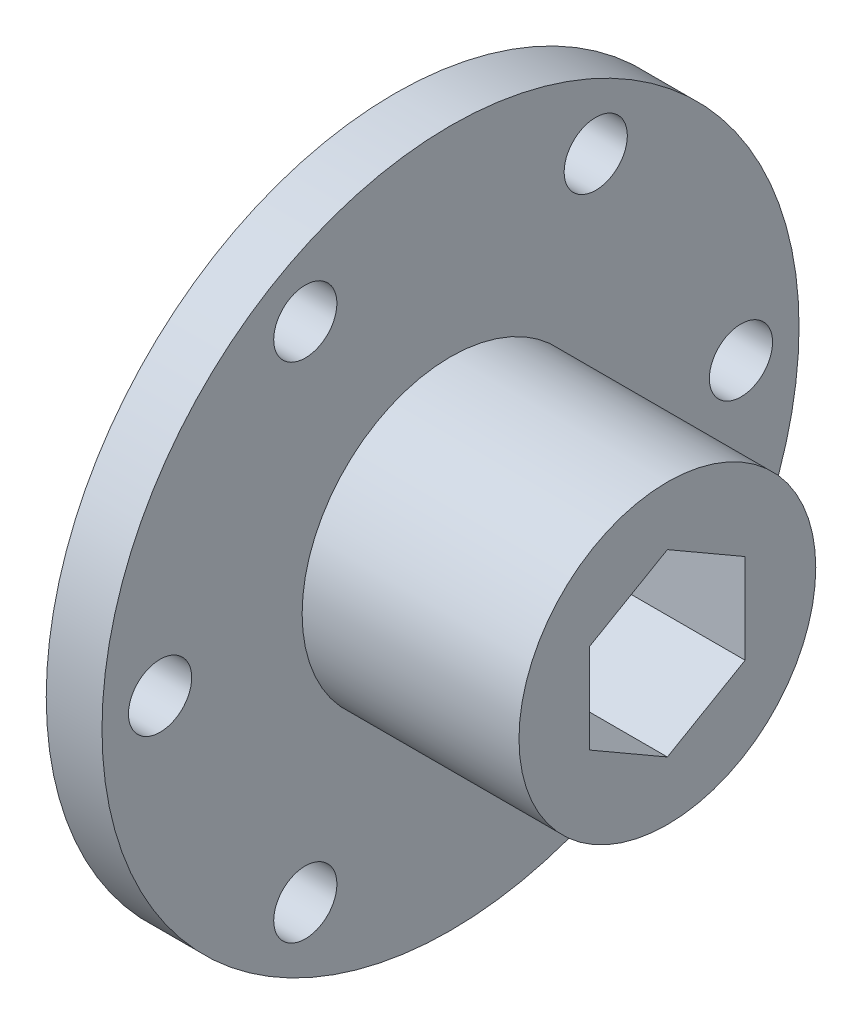
ISO-10303-21;
HEADER;
FILE_DESCRIPTION(('STEP AP214'),'2;1');
FILE_NAME('part.step','',(''),(''),'','','');
FILE_SCHEMA(('AUTOMOTIVE_DESIGN { 1 0 10303 214 1 1 1 1 }'));
ENDSEC;
DATA;
#1=APPLICATION_CONTEXT('core data for automotive mechanical design processes');
#2=APPLICATION_PROTOCOL_DEFINITION('international standard','automotive_design',2000,#1);
#3=PRODUCT_CONTEXT('',#1,'mechanical');
#4=PRODUCT('Part','Part','',(#3));
#5=PRODUCT_RELATED_PRODUCT_CATEGORY('part','',(#4));
#6=PRODUCT_DEFINITION_FORMATION('','',#4);
#7=PRODUCT_DEFINITION_CONTEXT('part definition',#1,'design');
#8=PRODUCT_DEFINITION('design','',#6,#7);
#9=PRODUCT_DEFINITION_SHAPE('','',#8);
#10=(LENGTH_UNIT() NAMED_UNIT(*) SI_UNIT(.MILLI.,.METRE.));
#11=(NAMED_UNIT(*) PLANE_ANGLE_UNIT() SI_UNIT($,.RADIAN.));
#12=(NAMED_UNIT(*) SI_UNIT($,.STERADIAN.) SOLID_ANGLE_UNIT());
#13=UNCERTAINTY_MEASURE_WITH_UNIT(LENGTH_MEASURE(1.E-05),#10,'distance_accuracy_value','');
#14=(GEOMETRIC_REPRESENTATION_CONTEXT(3) GLOBAL_UNCERTAINTY_ASSIGNED_CONTEXT((#13)) GLOBAL_UNIT_ASSIGNED_CONTEXT((#10,
#11,#12)) REPRESENTATION_CONTEXT('',''));
#15=CARTESIAN_POINT('',(0.,0.,0.));
#16=DIRECTION('',(0.,0.,1.));
#17=DIRECTION('',(1.,0.,0.));
#18=AXIS2_PLACEMENT_3D('',#15,#16,#17);
#19=CARTESIAN_POINT('',(-13.0350662460568,0.,0.));
#20=DIRECTION('',(1.,0.,0.));
#21=DIRECTION('',(0.,0.,-1.));
#22=AXIS2_PLACEMENT_3D('',#19,#20,#21);
#23=PLANE('',#22);
#24=CARTESIAN_POINT('',(-13.0350662460568,-20.6222299276169,11.90625));
#25=DIRECTION('',(1.,0.,0.));
#26=DIRECTION('',(0.,0.,-1.));
#27=AXIS2_PLACEMENT_3D('',#24,#25,#26);
#28=CIRCLE('',#27,2.59080000000001);
#29=CARTESIAN_POINT('',(-13.0350662460568,-20.6222299276169,9.31544999999996));
#30=VERTEX_POINT('',#29);
#31=EDGE_CURVE('E220',#30,#30,#28,.T.);
#32=ORIENTED_EDGE('',*,*,#31,.F.);
#33=EDGE_LOOP('',(#32));
#34=FACE_BOUND('',#33,.T.);
#35=CARTESIAN_POINT('',(-13.0350662460568,-20.6222299276169,-11.90625));
#36=DIRECTION('',(1.,0.,0.));
#37=DIRECTION('',(0.,0.,-1.));
#38=AXIS2_PLACEMENT_3D('',#35,#36,#37);
#39=CIRCLE('',#38,2.59080000000001);
#40=CARTESIAN_POINT('',(-13.0350662460568,-20.6222299276169,-14.49705));
#41=VERTEX_POINT('',#40);
#42=EDGE_CURVE('E230',#41,#41,#39,.T.);
#43=ORIENTED_EDGE('',*,*,#42,.F.);
#44=EDGE_LOOP('',(#43));
#45=FACE_BOUND('',#44,.T.);
#46=CARTESIAN_POINT('',(-13.0350662460568,0.,-23.8125));
#47=DIRECTION('',(1.,0.,0.));
#48=DIRECTION('',(0.,0.,-1.));
#49=AXIS2_PLACEMENT_3D('',#46,#47,#48);
#50=CIRCLE('',#49,2.59080000000001);
#51=CARTESIAN_POINT('',(-13.0350662460568,0.,-26.4033));
#52=VERTEX_POINT('',#51);
#53=EDGE_CURVE('E236',#52,#52,#50,.T.);
#54=ORIENTED_EDGE('',*,*,#53,.F.);
#55=EDGE_LOOP('',(#54));
#56=FACE_BOUND('',#55,.T.);
#57=CARTESIAN_POINT('',(-13.0350662460568,20.6222299276169,-11.90625));
#58=DIRECTION('',(1.,0.,0.));
#59=DIRECTION('',(0.,0.,-1.));
#60=AXIS2_PLACEMENT_3D('',#57,#58,#59);
#61=CIRCLE('',#60,2.59080000000001);
#62=CARTESIAN_POINT('',(-13.0350662460568,20.6222299276169,-14.49705));
#63=VERTEX_POINT('',#62);
#64=EDGE_CURVE('E242',#63,#63,#61,.T.);
#65=ORIENTED_EDGE('',*,*,#64,.F.);
#66=EDGE_LOOP('',(#65));
#67=FACE_BOUND('',#66,.T.);
#68=CARTESIAN_POINT('',(-13.0350662460568,20.6222299276169,11.90625));
#69=DIRECTION('',(1.,0.,0.));
#70=DIRECTION('',(0.,0.,-1.));
#71=AXIS2_PLACEMENT_3D('',#68,#69,#70);
#72=CIRCLE('',#71,2.59080000000001);
#73=CARTESIAN_POINT('',(-13.0350662460568,20.6222299276169,9.31544999999999));
#74=VERTEX_POINT('',#73);
#75=EDGE_CURVE('E248',#74,#74,#72,.T.);
#76=ORIENTED_EDGE('',*,*,#75,.F.);
#77=EDGE_LOOP('',(#76));
#78=FACE_BOUND('',#77,.T.);
#79=CARTESIAN_POINT('',(-13.0350662460568,0.,23.8125));
#80=DIRECTION('',(1.,0.,0.));
#81=DIRECTION('',(0.,0.,-1.));
#82=AXIS2_PLACEMENT_3D('',#79,#80,#81);
#83=CIRCLE('',#82,2.59080000000001);
#84=CARTESIAN_POINT('',(-13.0350662460568,0.,21.2217));
#85=VERTEX_POINT('',#84);
#86=EDGE_CURVE('E111',#85,#85,#83,.T.);
#87=ORIENTED_EDGE('',*,*,#86,.F.);
#88=EDGE_LOOP('',(#87));
#89=FACE_BOUND('',#88,.T.);
#90=CARTESIAN_POINT('',(-13.0350662460568,0.,0.));
#91=DIRECTION('',(1.,0.,0.));
#92=DIRECTION('',(0.,0.,-1.));
#93=AXIS2_PLACEMENT_3D('',#90,#91,#92);
#94=CIRCLE('',#93,28.575);
#95=CARTESIAN_POINT('',(-13.0350662460568,0.,-28.575));
#96=VERTEX_POINT('',#95);
#97=EDGE_CURVE('E41',#96,#96,#94,.T.);
#98=ORIENTED_EDGE('',*,*,#97,.T.);
#99=EDGE_LOOP('',(#98));
#100=FACE_BOUND('',#99,.T.);
#101=CARTESIAN_POINT('',(-13.0350662460568,0.,0.));
#102=DIRECTION('',(1.,0.,0.));
#103=DIRECTION('',(0.,0.,-1.));
#104=AXIS2_PLACEMENT_3D('',#101,#102,#103);
#105=CIRCLE('',#104,12.1666);
#106=CARTESIAN_POINT('',(-13.0350662460568,0.,-12.1666));
#107=VERTEX_POINT('',#106);
#108=EDGE_CURVE('E134',#107,#107,#105,.T.);
#109=ORIENTED_EDGE('',*,*,#108,.F.);
#110=EDGE_LOOP('',(#109));
#111=FACE_BOUND('',#110,.T.);
#112=ADVANCED_FACE('F33',(#34,#45,#56,#67,#78,#89,#100,#111),#23,.T.);
#113=CARTESIAN_POINT('',(-17.6070662460568,0.,0.));
#114=DIRECTION('',(1.,0.,0.));
#115=DIRECTION('',(0.,0.,-1.));
#116=AXIS2_PLACEMENT_3D('',#113,#114,#115);
#117=CYLINDRICAL_SURFACE('',#116,28.575);
#118=CARTESIAN_POINT('',(-17.6070662460568,0.,0.));
#119=DIRECTION('',(1.,0.,0.));
#120=DIRECTION('',(0.,0.,-1.));
#121=AXIS2_PLACEMENT_3D('',#118,#119,#120);
#122=CIRCLE('',#121,28.575);
#123=CARTESIAN_POINT('',(-17.6070662460568,0.,-28.575));
#124=VERTEX_POINT('',#123);
#125=EDGE_CURVE('E11',#124,#124,#122,.T.);
#126=ORIENTED_EDGE('',*,*,#125,.T.);
#127=EDGE_LOOP('',(#126));
#128=FACE_BOUND('',#127,.T.);
#129=ORIENTED_EDGE('',*,*,#97,.F.);
#130=EDGE_LOOP('',(#129));
#131=FACE_BOUND('',#130,.T.);
#132=ADVANCED_FACE('F35',(#128,#131),#117,.T.);
#133=CARTESIAN_POINT('',(-17.6070662460568,28.575,0.));
#134=DIRECTION('',(-1.,0.,0.));
#135=DIRECTION('',(0.,0.,1.));
#136=AXIS2_PLACEMENT_3D('',#133,#134,#135);
#137=PLANE('',#136);
#138=CARTESIAN_POINT('',(-17.6070662460568,-20.6222299276169,11.90625));
#139=DIRECTION('',(-1.,0.,0.));
#140=DIRECTION('',(0.,0.,1.));
#141=AXIS2_PLACEMENT_3D('',#138,#139,#140);
#142=CIRCLE('',#141,2.59080000000001);
#143=CARTESIAN_POINT('',(-17.6070662460568,-20.6222299276169,14.49705));
#144=VERTEX_POINT('',#143);
#145=EDGE_CURVE('E223',#144,#144,#142,.T.);
#146=ORIENTED_EDGE('',*,*,#145,.F.);
#147=EDGE_LOOP('',(#146));
#148=FACE_BOUND('',#147,.T.);
#149=CARTESIAN_POINT('',(-17.6070662460568,-20.6222299276169,-11.90625));
#150=DIRECTION('',(-1.,0.,0.));
#151=DIRECTION('',(0.,0.,1.));
#152=AXIS2_PLACEMENT_3D('',#149,#150,#151);
#153=CIRCLE('',#152,2.59080000000001);
#154=CARTESIAN_POINT('',(-17.6070662460568,-20.6222299276169,-9.31544999999999));
#155=VERTEX_POINT('',#154);
#156=EDGE_CURVE('E225',#155,#155,#153,.T.);
#157=ORIENTED_EDGE('',*,*,#156,.F.);
#158=EDGE_LOOP('',(#157));
#159=FACE_BOUND('',#158,.T.);
#160=CARTESIAN_POINT('',(-17.6070662460568,0.,-23.8125));
#161=DIRECTION('',(-1.,0.,0.));
#162=DIRECTION('',(0.,0.,1.));
#163=AXIS2_PLACEMENT_3D('',#160,#161,#162);
#164=CIRCLE('',#163,2.59080000000001);
#165=CARTESIAN_POINT('',(-17.6070662460568,0.,-21.2217));
#166=VERTEX_POINT('',#165);
#167=EDGE_CURVE('E233',#166,#166,#164,.T.);
#168=ORIENTED_EDGE('',*,*,#167,.F.);
#169=EDGE_LOOP('',(#168));
#170=FACE_BOUND('',#169,.T.);
#171=CARTESIAN_POINT('',(-17.6070662460568,20.6222299276169,-11.90625));
#172=DIRECTION('',(-1.,0.,0.));
#173=DIRECTION('',(0.,0.,1.));
#174=AXIS2_PLACEMENT_3D('',#171,#172,#173);
#175=CIRCLE('',#174,2.59080000000001);
#176=CARTESIAN_POINT('',(-17.6070662460568,20.6222299276169,-9.31544999999999));
#177=VERTEX_POINT('',#176);
#178=EDGE_CURVE('E239',#177,#177,#175,.T.);
#179=ORIENTED_EDGE('',*,*,#178,.F.);
#180=EDGE_LOOP('',(#179));
#181=FACE_BOUND('',#180,.T.);
#182=CARTESIAN_POINT('',(-17.6070662460568,20.6222299276169,11.90625));
#183=DIRECTION('',(-1.,0.,0.));
#184=DIRECTION('',(0.,0.,1.));
#185=AXIS2_PLACEMENT_3D('',#182,#183,#184);
#186=CIRCLE('',#185,2.59080000000001);
#187=CARTESIAN_POINT('',(-17.6070662460568,20.6222299276169,14.49705));
#188=VERTEX_POINT('',#187);
#189=EDGE_CURVE('E245',#188,#188,#186,.T.);
#190=ORIENTED_EDGE('',*,*,#189,.F.);
#191=EDGE_LOOP('',(#190));
#192=FACE_BOUND('',#191,.T.);
#193=CARTESIAN_POINT('',(-17.6070662460568,0.,23.8125));
#194=DIRECTION('',(-1.,0.,0.));
#195=DIRECTION('',(0.,0.,1.));
#196=AXIS2_PLACEMENT_3D('',#193,#194,#195);
#197=CIRCLE('',#196,2.59080000000001);
#198=CARTESIAN_POINT('',(-17.6070662460568,0.,26.4033));
#199=VERTEX_POINT('',#198);
#200=EDGE_CURVE('E250',#199,#199,#197,.T.);
#201=ORIENTED_EDGE('',*,*,#200,.F.);
#202=EDGE_LOOP('',(#201));
#203=FACE_BOUND('',#202,.T.);
#204=DIRECTION('',(0.,-0.5,0.866025403784438));
#205=VECTOR('',#204,1.);
#206=CARTESIAN_POINT('',(-17.6070662460568,-3.68085890619154,-6.3754));
#207=LINE('',#206,#205);
#208=CARTESIAN_POINT('',(-17.6070662460568,-3.68085890619154,-6.3754));
#209=VERTEX_POINT('',#208);
#210=CARTESIAN_POINT('',(-17.6070662460568,-7.36169781238309,0.));
#211=VERTEX_POINT('',#210);
#212=EDGE_CURVE('E48',#209,#211,#207,.T.);
#213=ORIENTED_EDGE('',*,*,#212,.F.);
#214=DIRECTION('',(0.,-1.,0.));
#215=VECTOR('',#214,1.);
#216=CARTESIAN_POINT('',(-17.6070662460568,3.68081890619155,-6.3754));
#217=LINE('',#216,#215);
#218=CARTESIAN_POINT('',(-17.6070662460568,3.68081890619155,-6.3754));
#219=VERTEX_POINT('',#218);
#220=EDGE_CURVE('E105',#219,#209,#217,.T.);
#221=ORIENTED_EDGE('',*,*,#220,.F.);
#222=DIRECTION('',(0.,-0.5,-0.866025403784439));
#223=VECTOR('',#222,1.);
#224=CARTESIAN_POINT('',(-17.6070662460568,7.36165781238309,0.));
#225=LINE('',#224,#223);
#226=CARTESIAN_POINT('',(-17.6070662460568,7.36165781238309,0.));
#227=VERTEX_POINT('',#226);
#228=EDGE_CURVE('E108',#227,#219,#225,.T.);
#229=ORIENTED_EDGE('',*,*,#228,.F.);
#230=DIRECTION('',(0.,0.5,-0.866025403784439));
#231=VECTOR('',#230,1.);
#232=CARTESIAN_POINT('',(-17.6070662460568,3.68081890619155,6.3754));
#233=LINE('',#232,#231);
#234=CARTESIAN_POINT('',(-17.6070662460568,3.68081890619155,6.3754));
#235=VERTEX_POINT('',#234);
#236=EDGE_CURVE('E127',#235,#227,#233,.T.);
#237=ORIENTED_EDGE('',*,*,#236,.F.);
#238=DIRECTION('',(0.,1.,0.));
#239=VECTOR('',#238,1.);
#240=CARTESIAN_POINT('',(-17.6070662460568,-3.68085890619154,6.3754));
#241=LINE('',#240,#239);
#242=CARTESIAN_POINT('',(-17.6070662460568,-3.68085890619154,6.3754));
#243=VERTEX_POINT('',#242);
#244=EDGE_CURVE('E124',#243,#235,#241,.T.);
#245=ORIENTED_EDGE('',*,*,#244,.F.);
#246=DIRECTION('',(0.,0.500000000000001,0.866025403784438));
#247=VECTOR('',#246,1.);
#248=CARTESIAN_POINT('',(-17.6070662460568,-7.36169781238309,0.));
#249=LINE('',#248,#247);
#250=EDGE_CURVE('E122',#211,#243,#249,.T.);
#251=ORIENTED_EDGE('',*,*,#250,.F.);
#252=EDGE_LOOP('',(#213,#221,#229,#237,#245,#251));
#253=FACE_BOUND('',#252,.T.);
#254=ORIENTED_EDGE('',*,*,#125,.F.);
#255=EDGE_LOOP('',(#254));
#256=FACE_BOUND('',#255,.T.);
#257=ADVANCED_FACE('F152',(#148,#159,#170,#181,#192,#203,#253,#256),#137,.T.);
#258=CARTESIAN_POINT('',(4.74493375394323,0.,0.));
#259=DIRECTION('',(-1.,0.,0.));
#260=DIRECTION('',(0.,0.,1.));
#261=AXIS2_PLACEMENT_3D('',#258,#259,#260);
#262=CYLINDRICAL_SURFACE('',#261,12.1666);
#263=CARTESIAN_POINT('',(4.74493375394323,0.,0.));
#264=DIRECTION('',(1.,0.,0.));
#265=DIRECTION('',(0.,0.,-1.));
#266=AXIS2_PLACEMENT_3D('',#263,#264,#265);
#267=CIRCLE('',#266,12.1666);
#268=CARTESIAN_POINT('',(4.74493375394323,0.,-12.1666));
#269=VERTEX_POINT('',#268);
#270=EDGE_CURVE('E142',#269,#269,#267,.T.);
#271=ORIENTED_EDGE('',*,*,#270,.F.);
#272=EDGE_LOOP('',(#271));
#273=FACE_BOUND('',#272,.T.);
#274=ORIENTED_EDGE('',*,*,#108,.T.);
#275=EDGE_LOOP('',(#274));
#276=FACE_BOUND('',#275,.T.);
#277=ADVANCED_FACE('F158',(#273,#276),#262,.T.);
#278=CARTESIAN_POINT('',(4.74493375394323,0.,0.));
#279=DIRECTION('',(1.,0.,0.));
#280=DIRECTION('',(0.,0.,-1.));
#281=AXIS2_PLACEMENT_3D('',#278,#279,#280);
#282=PLANE('',#281);
#283=DIRECTION('',(0.,-0.5,0.866025403784438));
#284=VECTOR('',#283,1.);
#285=CARTESIAN_POINT('',(4.74493375394323,-3.68085890619154,-6.3754));
#286=LINE('',#285,#284);
#287=CARTESIAN_POINT('',(4.74493375394323,-3.68085890619154,-6.3754));
#288=VERTEX_POINT('',#287);
#289=CARTESIAN_POINT('',(4.74493375394323,-7.36169781238309,0.));
#290=VERTEX_POINT('',#289);
#291=EDGE_CURVE('E88',#288,#290,#286,.T.);
#292=ORIENTED_EDGE('',*,*,#291,.T.);
#293=DIRECTION('',(0.,0.500000000000001,0.866025403784438));
#294=VECTOR('',#293,1.);
#295=CARTESIAN_POINT('',(4.74493375394323,-7.36169781238309,0.));
#296=LINE('',#295,#294);
#297=CARTESIAN_POINT('',(4.74493375394323,-3.68085890619154,6.3754));
#298=VERTEX_POINT('',#297);
#299=EDGE_CURVE('E97',#290,#298,#296,.T.);
#300=ORIENTED_EDGE('',*,*,#299,.T.);
#301=DIRECTION('',(0.,1.,0.));
#302=VECTOR('',#301,1.);
#303=CARTESIAN_POINT('',(4.74493375394323,-3.68085890619154,6.3754));
#304=LINE('',#303,#302);
#305=CARTESIAN_POINT('',(4.74493375394323,3.68081890619155,6.3754));
#306=VERTEX_POINT('',#305);
#307=EDGE_CURVE('E56',#298,#306,#304,.T.);
#308=ORIENTED_EDGE('',*,*,#307,.T.);
#309=DIRECTION('',(0.,0.5,-0.866025403784439));
#310=VECTOR('',#309,1.);
#311=CARTESIAN_POINT('',(4.74493375394323,3.68081890619155,6.3754));
#312=LINE('',#311,#310);
#313=CARTESIAN_POINT('',(4.74493375394323,7.36165781238309,0.));
#314=VERTEX_POINT('',#313);
#315=EDGE_CURVE('E115',#306,#314,#312,.T.);
#316=ORIENTED_EDGE('',*,*,#315,.T.);
#317=DIRECTION('',(0.,-0.5,-0.866025403784439));
#318=VECTOR('',#317,1.);
#319=CARTESIAN_POINT('',(4.74493375394323,7.36165781238309,0.));
#320=LINE('',#319,#318);
#321=CARTESIAN_POINT('',(4.74493375394323,3.68081890619155,-6.3754));
#322=VERTEX_POINT('',#321);
#323=EDGE_CURVE('E118',#314,#322,#320,.T.);
#324=ORIENTED_EDGE('',*,*,#323,.T.);
#325=DIRECTION('',(0.,-1.,0.));
#326=VECTOR('',#325,1.);
#327=CARTESIAN_POINT('',(4.74493375394323,3.68081890619155,-6.3754));
#328=LINE('',#327,#326);
#329=EDGE_CURVE('E94',#322,#288,#328,.T.);
#330=ORIENTED_EDGE('',*,*,#329,.T.);
#331=EDGE_LOOP('',(#292,#300,#308,#316,#324,#330));
#332=FACE_BOUND('',#331,.T.);
#333=ORIENTED_EDGE('',*,*,#270,.T.);
#334=EDGE_LOOP('',(#333));
#335=FACE_BOUND('',#334,.T.);
#336=ADVANCED_FACE('F101',(#332,#335),#282,.T.);
#337=CARTESIAN_POINT('',(4.74493375394323,-3.68085890619154,-6.3754));
#338=DIRECTION('',(0.,-0.866025403784439,-0.5));
#339=DIRECTION('',(0.,0.5,-0.866025403784439));
#340=AXIS2_PLACEMENT_3D('',#337,#338,#339);
#341=PLANE('',#340);
#342=ORIENTED_EDGE('',*,*,#212,.T.);
#343=DIRECTION('',(-1.,0.,0.));
#344=VECTOR('',#343,1.);
#345=CARTESIAN_POINT('',(4.74493375394323,-7.36169781238309,0.));
#346=LINE('',#345,#344);
#347=EDGE_CURVE('E84',#290,#211,#346,.T.);
#348=ORIENTED_EDGE('',*,*,#347,.F.);
#349=ORIENTED_EDGE('',*,*,#291,.F.);
#350=DIRECTION('',(-1.,0.,0.));
#351=VECTOR('',#350,1.);
#352=CARTESIAN_POINT('',(4.74493375394323,-3.68085890619154,-6.3754));
#353=LINE('',#352,#351);
#354=EDGE_CURVE('E132',#288,#209,#353,.T.);
#355=ORIENTED_EDGE('',*,*,#354,.T.);
#356=EDGE_LOOP('',(#342,#348,#349,#355));
#357=FACE_BOUND('',#356,.T.);
#358=ADVANCED_FACE('F86',(#357),#341,.F.);
#359=CARTESIAN_POINT('',(4.74493375394323,3.68081890619155,-6.3754));
#360=DIRECTION('',(0.,0.,-1.));
#361=DIRECTION('',(0.,1.,0.));
#362=AXIS2_PLACEMENT_3D('',#359,#360,#361);
#363=PLANE('',#362);
#364=ORIENTED_EDGE('',*,*,#220,.T.);
#365=ORIENTED_EDGE('',*,*,#354,.F.);
#366=ORIENTED_EDGE('',*,*,#329,.F.);
#367=DIRECTION('',(-1.,0.,0.));
#368=VECTOR('',#367,1.);
#369=CARTESIAN_POINT('',(4.74493375394323,3.68081890619155,-6.3754));
#370=LINE('',#369,#368);
#371=EDGE_CURVE('E135',#322,#219,#370,.T.);
#372=ORIENTED_EDGE('',*,*,#371,.T.);
#373=EDGE_LOOP('',(#364,#365,#366,#372));
#374=FACE_BOUND('',#373,.T.);
#375=ADVANCED_FACE('F176',(#374),#363,.F.);
#376=CARTESIAN_POINT('',(4.74493375394323,7.36165781238309,0.));
#377=DIRECTION('',(0.,0.866025403784439,-0.5));
#378=DIRECTION('',(0.,0.5,0.866025403784439));
#379=AXIS2_PLACEMENT_3D('',#376,#377,#378);
#380=PLANE('',#379);
#381=ORIENTED_EDGE('',*,*,#228,.T.);
#382=ORIENTED_EDGE('',*,*,#371,.F.);
#383=ORIENTED_EDGE('',*,*,#323,.F.);
#384=DIRECTION('',(-1.,0.,0.));
#385=VECTOR('',#384,1.);
#386=CARTESIAN_POINT('',(4.74493375394323,7.36165781238309,0.));
#387=LINE('',#386,#385);
#388=EDGE_CURVE('E137',#314,#227,#387,.T.);
#389=ORIENTED_EDGE('',*,*,#388,.T.);
#390=EDGE_LOOP('',(#381,#382,#383,#389));
#391=FACE_BOUND('',#390,.T.);
#392=ADVANCED_FACE('F186',(#391),#380,.F.);
#393=CARTESIAN_POINT('',(4.74493375394323,3.68081890619155,6.3754));
#394=DIRECTION('',(0.,0.866025403784439,0.5));
#395=DIRECTION('',(0.,-0.5,0.866025403784439));
#396=AXIS2_PLACEMENT_3D('',#393,#394,#395);
#397=PLANE('',#396);
#398=ORIENTED_EDGE('',*,*,#236,.T.);
#399=ORIENTED_EDGE('',*,*,#388,.F.);
#400=ORIENTED_EDGE('',*,*,#315,.F.);
#401=DIRECTION('',(-1.,0.,0.));
#402=VECTOR('',#401,1.);
#403=CARTESIAN_POINT('',(4.74493375394323,3.68081890619155,6.3754));
#404=LINE('',#403,#402);
#405=EDGE_CURVE('E139',#306,#235,#404,.T.);
#406=ORIENTED_EDGE('',*,*,#405,.T.);
#407=EDGE_LOOP('',(#398,#399,#400,#406));
#408=FACE_BOUND('',#407,.T.);
#409=ADVANCED_FACE('F183',(#408),#397,.F.);
#410=CARTESIAN_POINT('',(4.74493375394323,-3.68085890619154,6.3754));
#411=DIRECTION('',(0.,0.,1.));
#412=DIRECTION('',(0.,-1.,0.));
#413=AXIS2_PLACEMENT_3D('',#410,#411,#412);
#414=PLANE('',#413);
#415=ORIENTED_EDGE('',*,*,#244,.T.);
#416=ORIENTED_EDGE('',*,*,#405,.F.);
#417=ORIENTED_EDGE('',*,*,#307,.F.);
#418=DIRECTION('',(-1.,0.,0.));
#419=VECTOR('',#418,1.);
#420=CARTESIAN_POINT('',(4.74493375394323,-3.68085890619154,6.3754));
#421=LINE('',#420,#419);
#422=EDGE_CURVE('E93',#298,#243,#421,.T.);
#423=ORIENTED_EDGE('',*,*,#422,.T.);
#424=EDGE_LOOP('',(#415,#416,#417,#423));
#425=FACE_BOUND('',#424,.T.);
#426=ADVANCED_FACE('F180',(#425),#414,.F.);
#427=CARTESIAN_POINT('',(4.74493375394323,-7.36169781238309,0.));
#428=DIRECTION('',(0.,-0.866025403784438,0.500000000000001));
#429=DIRECTION('',(0.,-0.500000000000001,-0.866025403784438));
#430=AXIS2_PLACEMENT_3D('',#427,#428,#429);
#431=PLANE('',#430);
#432=ORIENTED_EDGE('',*,*,#250,.T.);
#433=ORIENTED_EDGE('',*,*,#422,.F.);
#434=ORIENTED_EDGE('',*,*,#299,.F.);
#435=ORIENTED_EDGE('',*,*,#347,.T.);
#436=EDGE_LOOP('',(#432,#433,#434,#435));
#437=FACE_BOUND('',#436,.T.);
#438=ADVANCED_FACE('F98',(#437),#431,.F.);
#439=CARTESIAN_POINT('',(-17.6070662460568,0.,23.8125));
#440=DIRECTION('',(-1.,0.,0.));
#441=DIRECTION('',(0.,0.,1.));
#442=AXIS2_PLACEMENT_3D('',#439,#440,#441);
#443=CYLINDRICAL_SURFACE('',#442,2.59080000000001);
#444=ORIENTED_EDGE('',*,*,#86,.T.);
#445=EDGE_LOOP('',(#444));
#446=FACE_BOUND('',#445,.T.);
#447=ORIENTED_EDGE('',*,*,#200,.T.);
#448=EDGE_LOOP('',(#447));
#449=FACE_BOUND('',#448,.T.);
#450=ADVANCED_FACE('F179',(#446,#449),#443,.F.);
#451=CARTESIAN_POINT('',(-17.6070662460568,20.6222299276169,11.90625));
#452=DIRECTION('',(-1.,0.,0.));
#453=DIRECTION('',(0.,0.,1.));
#454=AXIS2_PLACEMENT_3D('',#451,#452,#453);
#455=CYLINDRICAL_SURFACE('',#454,2.59080000000001);
#456=ORIENTED_EDGE('',*,*,#75,.T.);
#457=EDGE_LOOP('',(#456));
#458=FACE_BOUND('',#457,.T.);
#459=ORIENTED_EDGE('',*,*,#189,.T.);
#460=EDGE_LOOP('',(#459));
#461=FACE_BOUND('',#460,.T.);
#462=ADVANCED_FACE('F196',(#458,#461),#455,.F.);
#463=CARTESIAN_POINT('',(-17.6070662460568,20.6222299276169,-11.90625));
#464=DIRECTION('',(-1.,0.,0.));
#465=DIRECTION('',(0.,0.,1.));
#466=AXIS2_PLACEMENT_3D('',#463,#464,#465);
#467=CYLINDRICAL_SURFACE('',#466,2.59080000000001);
#468=ORIENTED_EDGE('',*,*,#64,.T.);
#469=EDGE_LOOP('',(#468));
#470=FACE_BOUND('',#469,.T.);
#471=ORIENTED_EDGE('',*,*,#178,.T.);
#472=EDGE_LOOP('',(#471));
#473=FACE_BOUND('',#472,.T.);
#474=ADVANCED_FACE('F200',(#470,#473),#467,.F.);
#475=CARTESIAN_POINT('',(-17.6070662460568,0.,-23.8125));
#476=DIRECTION('',(-1.,0.,0.));
#477=DIRECTION('',(0.,0.,1.));
#478=AXIS2_PLACEMENT_3D('',#475,#476,#477);
#479=CYLINDRICAL_SURFACE('',#478,2.59080000000001);
#480=ORIENTED_EDGE('',*,*,#53,.T.);
#481=EDGE_LOOP('',(#480));
#482=FACE_BOUND('',#481,.T.);
#483=ORIENTED_EDGE('',*,*,#167,.T.);
#484=EDGE_LOOP('',(#483));
#485=FACE_BOUND('',#484,.T.);
#486=ADVANCED_FACE('F204',(#482,#485),#479,.F.);
#487=CARTESIAN_POINT('',(-17.6070662460568,-20.6222299276169,-11.90625));
#488=DIRECTION('',(-1.,0.,0.));
#489=DIRECTION('',(0.,0.,1.));
#490=AXIS2_PLACEMENT_3D('',#487,#488,#489);
#491=CYLINDRICAL_SURFACE('',#490,2.59080000000001);
#492=ORIENTED_EDGE('',*,*,#42,.T.);
#493=EDGE_LOOP('',(#492));
#494=FACE_BOUND('',#493,.T.);
#495=ORIENTED_EDGE('',*,*,#156,.T.);
#496=EDGE_LOOP('',(#495));
#497=FACE_BOUND('',#496,.T.);
#498=ADVANCED_FACE('F208',(#494,#497),#491,.F.);
#499=CARTESIAN_POINT('',(-17.6070662460568,-20.6222299276169,11.90625));
#500=DIRECTION('',(-1.,0.,0.));
#501=DIRECTION('',(0.,0.,1.));
#502=AXIS2_PLACEMENT_3D('',#499,#500,#501);
#503=CYLINDRICAL_SURFACE('',#502,2.59080000000001);
#504=ORIENTED_EDGE('',*,*,#31,.T.);
#505=EDGE_LOOP('',(#504));
#506=FACE_BOUND('',#505,.T.);
#507=ORIENTED_EDGE('',*,*,#145,.T.);
#508=EDGE_LOOP('',(#507));
#509=FACE_BOUND('',#508,.T.);
#510=ADVANCED_FACE('F212',(#506,#509),#503,.F.);
#511=CLOSED_SHELL('',(#112,#132,#257,#277,#336,#358,#375,#392,#409,#426,#438,#450,#462,#474,
#486,#498,#510));
#512=MANIFOLD_SOLID_BREP('B2',#511);
#513=ADVANCED_BREP_SHAPE_REPRESENTATION('',(#18,#512),#14);
#514=SHAPE_DEFINITION_REPRESENTATION(#9,#513);
ENDSEC;
END-ISO-10303-21;
